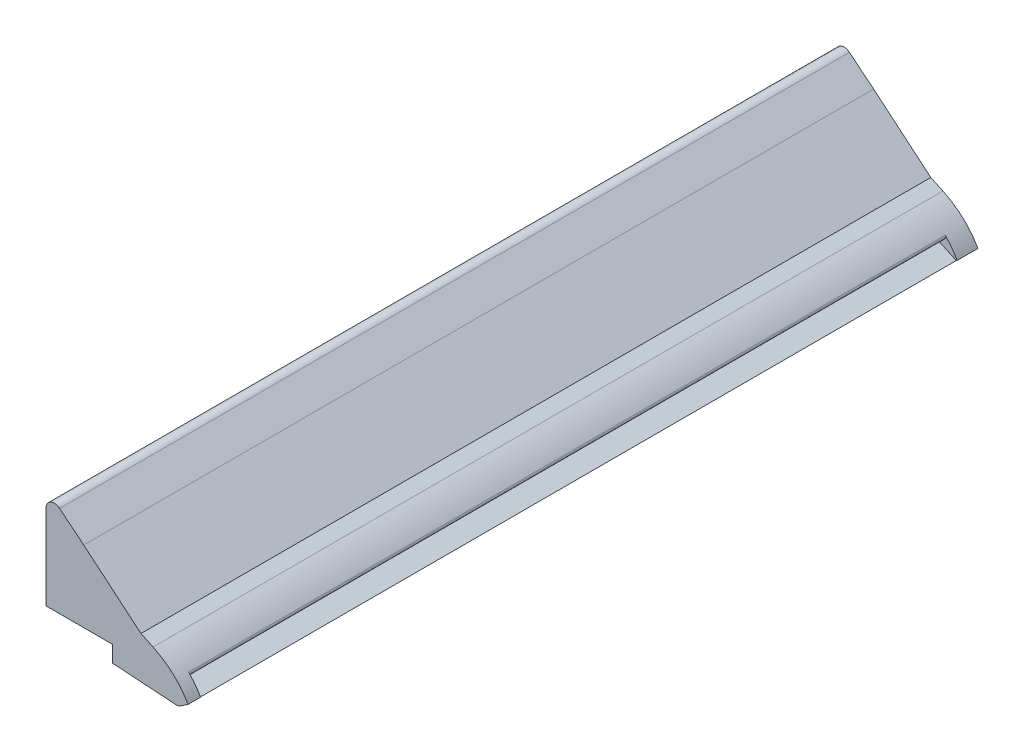
ISO-10303-21;
HEADER;
FILE_DESCRIPTION(('STEP AP214'),'2;1');
FILE_NAME('part.step','',(''),(''),'','','');
FILE_SCHEMA(('AUTOMOTIVE_DESIGN { 1 0 10303 214 1 1 1 1 }'));
ENDSEC;
DATA;
#1=APPLICATION_CONTEXT('core data for automotive mechanical design processes');
#2=APPLICATION_PROTOCOL_DEFINITION('international standard','automotive_design',2000,#1);
#3=PRODUCT_CONTEXT('',#1,'mechanical');
#4=PRODUCT('Part','Part','',(#3));
#5=PRODUCT_RELATED_PRODUCT_CATEGORY('part','',(#4));
#6=PRODUCT_DEFINITION_FORMATION('','',#4);
#7=PRODUCT_DEFINITION_CONTEXT('part definition',#1,'design');
#8=PRODUCT_DEFINITION('design','',#6,#7);
#9=PRODUCT_DEFINITION_SHAPE('','',#8);
#10=(LENGTH_UNIT() NAMED_UNIT(*) SI_UNIT(.MILLI.,.METRE.));
#11=(NAMED_UNIT(*) PLANE_ANGLE_UNIT() SI_UNIT($,.RADIAN.));
#12=(NAMED_UNIT(*) SI_UNIT($,.STERADIAN.) SOLID_ANGLE_UNIT());
#13=UNCERTAINTY_MEASURE_WITH_UNIT(LENGTH_MEASURE(1.E-05),#10,'distance_accuracy_value','');
#14=(GEOMETRIC_REPRESENTATION_CONTEXT(3) GLOBAL_UNCERTAINTY_ASSIGNED_CONTEXT((#13)) GLOBAL_UNIT_ASSIGNED_CONTEXT((#10,
#11,#12)) REPRESENTATION_CONTEXT('',''));
#15=CARTESIAN_POINT('',(0.,0.,0.));
#16=DIRECTION('',(0.,0.,1.));
#17=DIRECTION('',(1.,0.,0.));
#18=AXIS2_PLACEMENT_3D('',#15,#16,#17);
#19=CARTESIAN_POINT('',(-16.,12.1896302264411,190.));
#20=DIRECTION('',(1.,0.,0.));
#21=DIRECTION('',(0.,1.,0.));
#22=AXIS2_PLACEMENT_3D('',#19,#20,#21);
#23=PLANE('',#22);
#24=DIRECTION('',(0.,-1.,0.));
#25=VECTOR('',#24,1.);
#26=CARTESIAN_POINT('',(-16.,29.6000463820284,190.));
#27=LINE('',#26,#25);
#28=CARTESIAN_POINT('',(-16.,25.3955733440635,190.));
#29=VERTEX_POINT('',#28);
#30=CARTESIAN_POINT('',(-16.,5.,190.));
#31=VERTEX_POINT('',#30);
#32=EDGE_CURVE('E217',#29,#31,#27,.T.);
#33=ORIENTED_EDGE('',*,*,#32,.F.);
#34=DIRECTION('',(0.,0.,-1.));
#35=VECTOR('',#34,1.);
#36=CARTESIAN_POINT('',(-16.,25.3955733440635,190.));
#37=LINE('',#36,#35);
#38=CARTESIAN_POINT('',(-16.,25.3955733440635,0.));
#39=VERTEX_POINT('',#38);
#40=EDGE_CURVE('E208',#29,#39,#37,.T.);
#41=ORIENTED_EDGE('',*,*,#40,.T.);
#42=DIRECTION('',(0.,-1.,0.));
#43=VECTOR('',#42,1.);
#44=CARTESIAN_POINT('',(-16.,12.1896302264411,0.));
#45=LINE('',#44,#43);
#46=CARTESIAN_POINT('',(-16.,5.,0.));
#47=VERTEX_POINT('',#46);
#48=EDGE_CURVE('E215',#39,#47,#45,.T.);
#49=ORIENTED_EDGE('',*,*,#48,.T.);
#50=DIRECTION('',(0.,0.,-1.));
#51=VECTOR('',#50,1.);
#52=CARTESIAN_POINT('',(-16.,5.,190.));
#53=LINE('',#52,#51);
#54=EDGE_CURVE('E185',#31,#47,#53,.T.);
#55=ORIENTED_EDGE('',*,*,#54,.F.);
#56=EDGE_LOOP('',(#33,#41,#49,#55));
#57=FACE_BOUND('',#56,.T.);
#58=ADVANCED_FACE('F33',(#57),#23,.F.);
#59=CARTESIAN_POINT('',(-16.,5.,190.));
#60=DIRECTION('',(0.,1.,0.));
#61=DIRECTION('',(0.,0.,1.));
#62=AXIS2_PLACEMENT_3D('',#59,#60,#61);
#63=PLANE('',#62);
#64=DIRECTION('',(1.,0.,0.));
#65=VECTOR('',#64,1.);
#66=CARTESIAN_POINT('',(-16.,5.,0.));
#67=LINE('',#66,#65);
#68=CARTESIAN_POINT('',(0.,5.,0.));
#69=VERTEX_POINT('',#68);
#70=EDGE_CURVE('E223',#47,#69,#67,.T.);
#71=ORIENTED_EDGE('',*,*,#70,.T.);
#72=DIRECTION('',(0.,0.,-1.));
#73=VECTOR('',#72,1.);
#74=CARTESIAN_POINT('',(0.,5.,190.));
#75=LINE('',#74,#73);
#76=CARTESIAN_POINT('',(0.,5.,190.));
#77=VERTEX_POINT('',#76);
#78=EDGE_CURVE('E249',#77,#69,#75,.T.);
#79=ORIENTED_EDGE('',*,*,#78,.F.);
#80=DIRECTION('',(1.,0.,0.));
#81=VECTOR('',#80,1.);
#82=CARTESIAN_POINT('',(-16.,5.,190.));
#83=LINE('',#82,#81);
#84=EDGE_CURVE('E270',#31,#77,#83,.T.);
#85=ORIENTED_EDGE('',*,*,#84,.F.);
#86=ORIENTED_EDGE('',*,*,#54,.T.);
#87=EDGE_LOOP('',(#71,#79,#85,#86));
#88=FACE_BOUND('',#87,.T.);
#89=ADVANCED_FACE('F312',(#88),#63,.F.);
#90=CARTESIAN_POINT('',(0.,5.,190.));
#91=DIRECTION('',(1.,0.,0.));
#92=DIRECTION('',(0.,1.,0.));
#93=AXIS2_PLACEMENT_3D('',#90,#91,#92);
#94=PLANE('',#93);
#95=DIRECTION('',(0.,-1.,0.));
#96=VECTOR('',#95,1.);
#97=CARTESIAN_POINT('',(0.,5.,0.));
#98=LINE('',#97,#96);
#99=CARTESIAN_POINT('',(0.,1.07124124526952,0.));
#100=VERTEX_POINT('',#99);
#101=EDGE_CURVE('E226',#69,#100,#98,.T.);
#102=ORIENTED_EDGE('',*,*,#101,.T.);
#103=DIRECTION('',(0.,0.,1.));
#104=VECTOR('',#103,1.);
#105=CARTESIAN_POINT('',(0.,1.07124124526952,-13.));
#106=LINE('',#105,#104);
#107=CARTESIAN_POINT('',(0.,1.07124124526952,190.));
#108=VERTEX_POINT('',#107);
#109=EDGE_CURVE('E298',#100,#108,#106,.T.);
#110=ORIENTED_EDGE('',*,*,#109,.T.);
#111=DIRECTION('',(0.,-1.,0.));
#112=VECTOR('',#111,1.);
#113=CARTESIAN_POINT('',(0.,5.,190.));
#114=LINE('',#113,#112);
#115=EDGE_CURVE('E265',#77,#108,#114,.T.);
#116=ORIENTED_EDGE('',*,*,#115,.F.);
#117=ORIENTED_EDGE('',*,*,#78,.T.);
#118=EDGE_LOOP('',(#102,#110,#116,#117));
#119=FACE_BOUND('',#118,.T.);
#120=ADVANCED_FACE('F308',(#119),#94,.F.);
#121=CARTESIAN_POINT('',(19.,5.,190.));
#122=DIRECTION('',(-0.422618261740694,-0.906307787036653,0.));
#123=DIRECTION('',(0.906307787036653,-0.422618261740694,0.));
#124=AXIS2_PLACEMENT_3D('',#121,#122,#123);
#125=PLANE('',#124);
#126=DIRECTION('',(-0.906307787036653,0.422618261740694,0.));
#127=VECTOR('',#126,1.);
#128=CARTESIAN_POINT('',(19.,5.,190.));
#129=LINE('',#128,#127);
#130=CARTESIAN_POINT('',(9.75376845876004,9.31158857675442,190.));
#131=VERTEX_POINT('',#130);
#132=CARTESIAN_POINT('',(6.83805716986868,10.6712070797334,190.));
#133=VERTEX_POINT('',#132);
#134=EDGE_CURVE('E256',#131,#133,#129,.T.);
#135=ORIENTED_EDGE('',*,*,#134,.F.);
#136=DIRECTION('',(0.,0.,-1.));
#137=VECTOR('',#136,1.);
#138=CARTESIAN_POINT('',(9.75376845876005,9.31158857675442,190.));
#139=LINE('',#138,#137);
#140=CARTESIAN_POINT('',(9.75376845876004,9.31158857675442,0.));
#141=VERTEX_POINT('',#140);
#142=EDGE_CURVE('E175',#131,#141,#139,.T.);
#143=ORIENTED_EDGE('',*,*,#142,.T.);
#144=DIRECTION('',(-0.906307787036653,0.422618261740694,0.));
#145=VECTOR('',#144,1.);
#146=CARTESIAN_POINT('',(19.,5.,0.));
#147=LINE('',#146,#145);
#148=CARTESIAN_POINT('',(6.83805716986868,10.6712070797334,0.));
#149=VERTEX_POINT('',#148);
#150=EDGE_CURVE('E237',#141,#149,#147,.T.);
#151=ORIENTED_EDGE('',*,*,#150,.T.);
#152=DIRECTION('',(0.,0.,-1.));
#153=VECTOR('',#152,1.);
#154=CARTESIAN_POINT('',(6.83805716986868,10.6712070797334,190.));
#155=LINE('',#154,#153);
#156=EDGE_CURVE('E246',#133,#149,#155,.T.);
#157=ORIENTED_EDGE('',*,*,#156,.F.);
#158=EDGE_LOOP('',(#135,#143,#151,#157));
#159=FACE_BOUND('',#158,.T.);
#160=ADVANCED_FACE('F254',(#159),#125,.F.);
#161=CARTESIAN_POINT('',(6.83805716986868,10.6712070797334,190.));
#162=DIRECTION('',(-0.642787609686535,-0.766044443118982,0.));
#163=DIRECTION('',(0.766044443118982,-0.642787609686535,0.));
#164=AXIS2_PLACEMENT_3D('',#161,#162,#163);
#165=PLANE('',#164);
#166=DIRECTION('',(-0.766044443118982,0.642787609686535,0.));
#167=VECTOR('',#166,1.);
#168=CARTESIAN_POINT('',(6.83805716986868,10.6712070797334,0.));
#169=LINE('',#168,#167);
#170=CARTESIAN_POINT('',(-6.91649822035299,22.2126494346758,0.));
#171=VERTEX_POINT('',#170);
#172=EDGE_CURVE('E239',#149,#171,#169,.T.);
#173=ORIENTED_EDGE('',*,*,#172,.T.);
#174=DIRECTION('',(0.,0.,-1.));
#175=VECTOR('',#174,1.);
#176=CARTESIAN_POINT('',(-6.91649822035299,22.2126494346758,190.));
#177=LINE('',#176,#175);
#178=CARTESIAN_POINT('',(-6.91649822035299,22.2126494346758,190.));
#179=VERTEX_POINT('',#178);
#180=EDGE_CURVE('E243',#179,#171,#177,.T.);
#181=ORIENTED_EDGE('',*,*,#180,.F.);
#182=DIRECTION('',(-0.766044443118982,0.642787609686535,0.));
#183=VECTOR('',#182,1.);
#184=CARTESIAN_POINT('',(6.83805716986868,10.6712070797334,190.));
#185=LINE('',#184,#183);
#186=EDGE_CURVE('E264',#133,#179,#185,.T.);
#187=ORIENTED_EDGE('',*,*,#186,.F.);
#188=ORIENTED_EDGE('',*,*,#156,.T.);
#189=EDGE_LOOP('',(#173,#181,#187,#188));
#190=FACE_BOUND('',#189,.T.);
#191=ADVANCED_FACE('F261',(#190),#165,.F.);
#192=CARTESIAN_POINT('',(-6.91649822035299,22.2126494346758,190.));
#193=DIRECTION('',(-0.630955346125227,-0.775819148510782,0.));
#194=DIRECTION('',(0.775819148510782,-0.630955346125227,0.));
#195=AXIS2_PLACEMENT_3D('',#192,#193,#194);
#196=PLANE('',#195);
#197=DIRECTION('',(-0.775819148510782,0.630955346125227,0.));
#198=VECTOR('',#197,1.);
#199=CARTESIAN_POINT('',(-6.91649822035299,22.2126494346758,0.));
#200=LINE('',#199,#198);
#201=CARTESIAN_POINT('',(-12.7380893077496,26.9472116410851,0.));
#202=VERTEX_POINT('',#201);
#203=EDGE_CURVE('E241',#171,#202,#200,.T.);
#204=ORIENTED_EDGE('',*,*,#203,.T.);
#205=DIRECTION('',(0.,0.,-1.));
#206=VECTOR('',#205,1.);
#207=CARTESIAN_POINT('',(-12.7380893077496,26.9472116410851,190.));
#208=LINE('',#207,#206);
#209=CARTESIAN_POINT('',(-12.7380893077496,26.9472116410851,190.));
#210=VERTEX_POINT('',#209);
#211=EDGE_CURVE('E41',#202,#210,#208,.F.);
#212=ORIENTED_EDGE('',*,*,#211,.T.);
#213=DIRECTION('',(-0.775819148510782,0.630955346125227,0.));
#214=VECTOR('',#213,1.);
#215=CARTESIAN_POINT('',(-6.91649822035299,22.2126494346758,190.));
#216=LINE('',#215,#214);
#217=EDGE_CURVE('E232',#179,#210,#216,.T.);
#218=ORIENTED_EDGE('',*,*,#217,.F.);
#219=ORIENTED_EDGE('',*,*,#180,.T.);
#220=EDGE_LOOP('',(#204,#212,#218,#219));
#221=FACE_BOUND('',#220,.T.);
#222=ADVANCED_FACE('F263',(#221),#196,.F.);
#223=CARTESIAN_POINT('',(0.,0.,190.));
#224=DIRECTION('',(0.,0.,1.));
#225=DIRECTION('',(1.,0.,0.));
#226=AXIS2_PLACEMENT_3D('',#223,#224,#225);
#227=PLANE('',#226);
#228=ORIENTED_EDGE('',*,*,#217,.T.);
#229=CARTESIAN_POINT('',(-14.,25.3955733440635,190.));
#230=DIRECTION('',(0.,0.,1.));
#231=DIRECTION('',(1.,0.,0.));
#232=AXIS2_PLACEMENT_3D('',#229,#230,#231);
#233=CIRCLE('',#232,2.);
#234=EDGE_CURVE('E11',#210,#29,#233,.T.);
#235=ORIENTED_EDGE('',*,*,#234,.T.);
#236=ORIENTED_EDGE('',*,*,#32,.T.);
#237=ORIENTED_EDGE('',*,*,#84,.T.);
#238=ORIENTED_EDGE('',*,*,#115,.T.);
#239=DIRECTION('',(-0.997726373210861,0.0673949864567225,0.));
#240=VECTOR('',#239,1.);
#241=CARTESIAN_POINT('',(0.,1.07124124526952,190.));
#242=LINE('',#241,#240);
#243=CARTESIAN_POINT('',(15.1751652634888,0.0461805824747412,190.));
#244=VERTEX_POINT('',#243);
#245=EDGE_CURVE('E170',#244,#108,#242,.T.);
#246=ORIENTED_EDGE('',*,*,#245,.F.);
#247=CARTESIAN_POINT('',(15.3099552364022,2.04163332889646,190.));
#248=DIRECTION('',(0.,0.,1.));
#249=DIRECTION('',(1.,0.,0.));
#250=AXIS2_PLACEMENT_3D('',#247,#248,#249);
#251=CIRCLE('',#250,2.);
#252=CARTESIAN_POINT('',(16.4271748880226,0.382772198471969,190.));
#253=VERTEX_POINT('',#252);
#254=EDGE_CURVE('E169',#244,#253,#251,.T.);
#255=ORIENTED_EDGE('',*,*,#254,.T.);
#256=DIRECTION('',(-0.829430565212247,-0.558609825810192,0.));
#257=VECTOR('',#256,1.);
#258=CARTESIAN_POINT('',(15.8588301395827,0.,190.));
#259=LINE('',#258,#257);
#260=CARTESIAN_POINT('',(18.1907430791427,1.57051058353364,190.));
#261=VERTEX_POINT('',#260);
#262=EDGE_CURVE('E155',#261,#253,#259,.T.);
#263=ORIENTED_EDGE('',*,*,#262,.F.);
#264=CARTESIAN_POINT('',(1.72402148568686,-7.90825937694198,190.));
#265=DIRECTION('',(0.,0.,1.));
#266=DIRECTION('',(1.,0.,0.));
#267=AXIS2_PLACEMENT_3D('',#264,#265,#266);
#268=CIRCLE('',#267,19.);
#269=EDGE_CURVE('E163',#261,#131,#268,.T.);
#270=ORIENTED_EDGE('',*,*,#269,.T.);
#271=ORIENTED_EDGE('',*,*,#134,.T.);
#272=ORIENTED_EDGE('',*,*,#186,.T.);
#273=EDGE_LOOP('',(#228,#235,#236,#237,#238,#246,#255,#263,#270,#271,#272));
#274=FACE_BOUND('',#273,.T.);
#275=ADVANCED_FACE('F166',(#274),#227,.T.);
#276=CARTESIAN_POINT('',(0.,0.,0.));
#277=DIRECTION('',(0.,0.,1.));
#278=DIRECTION('',(1.,0.,0.));
#279=AXIS2_PLACEMENT_3D('',#276,#277,#278);
#280=PLANE('',#279);
#281=ORIENTED_EDGE('',*,*,#48,.F.);
#282=CARTESIAN_POINT('',(-14.,25.3955733440635,0.));
#283=DIRECTION('',(0.,0.,1.));
#284=DIRECTION('',(1.,0.,0.));
#285=AXIS2_PLACEMENT_3D('',#282,#283,#284);
#286=CIRCLE('',#285,2.);
#287=EDGE_CURVE('E55',#39,#202,#286,.F.);
#288=ORIENTED_EDGE('',*,*,#287,.T.);
#289=ORIENTED_EDGE('',*,*,#203,.F.);
#290=ORIENTED_EDGE('',*,*,#172,.F.);
#291=ORIENTED_EDGE('',*,*,#150,.F.);
#292=CARTESIAN_POINT('',(1.72402148568686,-7.90825937694198,0.));
#293=DIRECTION('',(0.,0.,1.));
#294=DIRECTION('',(1.,0.,0.));
#295=AXIS2_PLACEMENT_3D('',#292,#293,#294);
#296=CIRCLE('',#295,19.);
#297=CARTESIAN_POINT('',(18.1907430791427,1.57051058353364,0.));
#298=VERTEX_POINT('',#297);
#299=EDGE_CURVE('E176',#141,#298,#296,.F.);
#300=ORIENTED_EDGE('',*,*,#299,.T.);
#301=DIRECTION('',(-0.829430565212247,-0.558609825810192,0.));
#302=VECTOR('',#301,1.);
#303=CARTESIAN_POINT('',(4.94866765959747,-7.34784105881836,0.));
#304=LINE('',#303,#302);
#305=CARTESIAN_POINT('',(16.4271748880226,0.382772198471971,0.));
#306=VERTEX_POINT('',#305);
#307=EDGE_CURVE('E285',#298,#306,#304,.T.);
#308=ORIENTED_EDGE('',*,*,#307,.T.);
#309=CARTESIAN_POINT('',(15.3099552364022,2.04163332889646,0.));
#310=DIRECTION('',(0.,0.,1.));
#311=DIRECTION('',(1.,0.,0.));
#312=AXIS2_PLACEMENT_3D('',#309,#310,#311);
#313=CIRCLE('',#312,2.);
#314=CARTESIAN_POINT('',(15.1751652634888,0.046180582474741,0.));
#315=VERTEX_POINT('',#314);
#316=EDGE_CURVE('E206',#306,#315,#313,.F.);
#317=ORIENTED_EDGE('',*,*,#316,.T.);
#318=DIRECTION('',(-0.997726373210861,0.0673949864567226,0.));
#319=VECTOR('',#318,1.);
#320=CARTESIAN_POINT('',(0.072032141799582,1.06637557733552,0.));
#321=LINE('',#320,#319);
#322=EDGE_CURVE('E187',#315,#100,#321,.T.);
#323=ORIENTED_EDGE('',*,*,#322,.T.);
#324=ORIENTED_EDGE('',*,*,#101,.F.);
#325=ORIENTED_EDGE('',*,*,#70,.F.);
#326=EDGE_LOOP('',(#281,#288,#289,#290,#291,#300,#308,#317,#323,#324,#325));
#327=FACE_BOUND('',#326,.T.);
#328=ADVANCED_FACE('F221',(#327),#280,.F.);
#329=CARTESIAN_POINT('',(2.87384425926701,8.45236523481401,187.));
#330=DIRECTION('',(0.4226182617407,0.90630778703665,0.));
#331=DIRECTION('',(-0.90630778703665,0.4226182617407,0.));
#332=AXIS2_PLACEMENT_3D('',#329,#330,#331);
#333=PLANE('',#332);
#334=DIRECTION('',(0.,0.,1.));
#335=VECTOR('',#334,1.);
#336=CARTESIAN_POINT('',(17.9621643544492,1.41656602573658,187.));
#337=LINE('',#336,#335);
#338=CARTESIAN_POINT('',(17.9621643544492,1.41656602573659,5.));
#339=VERTEX_POINT('',#338);
#340=CARTESIAN_POINT('',(17.9621643544492,1.41656602573658,187.));
#341=VERTEX_POINT('',#340);
#342=EDGE_CURVE('E294',#339,#341,#337,.T.);
#343=ORIENTED_EDGE('',*,*,#342,.F.);
#344=DIRECTION('',(0.90630778703665,-0.4226182617407,0.));
#345=VECTOR('',#344,1.);
#346=CARTESIAN_POINT('',(2.87384425926701,8.45236523481401,5.));
#347=LINE('',#346,#345);
#348=CARTESIAN_POINT('',(2.87384425926701,8.45236523481401,5.));
#349=VERTEX_POINT('',#348);
#350=EDGE_CURVE('E279',#349,#339,#347,.T.);
#351=ORIENTED_EDGE('',*,*,#350,.F.);
#352=DIRECTION('',(0.,0.,-1.));
#353=VECTOR('',#352,1.);
#354=CARTESIAN_POINT('',(2.87384425926701,8.45236523481401,187.));
#355=LINE('',#354,#353);
#356=CARTESIAN_POINT('',(2.87384425926701,8.45236523481401,187.));
#357=VERTEX_POINT('',#356);
#358=EDGE_CURVE('E224',#357,#349,#355,.T.);
#359=ORIENTED_EDGE('',*,*,#358,.F.);
#360=DIRECTION('',(0.90630778703665,-0.4226182617407,0.));
#361=VECTOR('',#360,1.);
#362=CARTESIAN_POINT('',(2.87384425926701,8.45236523481401,187.));
#363=LINE('',#362,#361);
#364=EDGE_CURVE('E287',#357,#341,#363,.T.);
#365=ORIENTED_EDGE('',*,*,#364,.T.);
#366=EDGE_LOOP('',(#343,#351,#359,#365));
#367=FACE_BOUND('',#366,.T.);
#368=ADVANCED_FACE('F326',(#367),#333,.T.);
#369=CARTESIAN_POINT('',(21.6339273926111,1.35946168055497,187.));
#370=DIRECTION('',(-0.4226182617407,-0.90630778703665,0.));
#371=DIRECTION('',(0.90630778703665,-0.4226182617407,0.));
#372=AXIS2_PLACEMENT_3D('',#369,#370,#371);
#373=PLANE('',#372);
#374=DIRECTION('',(-0.90630778703665,0.4226182617407,0.));
#375=VECTOR('',#374,1.);
#376=CARTESIAN_POINT('',(21.6339273926111,1.35946168055497,5.));
#377=LINE('',#376,#375);
#378=CARTESIAN_POINT('',(14.7372191767647,4.57544953766465,5.));
#379=VERTEX_POINT('',#378);
#380=CARTESIAN_POINT('',(3.50777165187806,9.81182691536898,5.));
#381=VERTEX_POINT('',#380);
#382=EDGE_CURVE('E276',#379,#381,#377,.T.);
#383=ORIENTED_EDGE('',*,*,#382,.F.);
#384=DIRECTION('',(0.,0.,-1.));
#385=VECTOR('',#384,1.);
#386=CARTESIAN_POINT('',(14.7372191767647,4.57544953766465,187.));
#387=LINE('',#386,#385);
#388=CARTESIAN_POINT('',(14.7372191767647,4.57544953766465,187.));
#389=VERTEX_POINT('',#388);
#390=EDGE_CURVE('E189',#379,#389,#387,.F.);
#391=ORIENTED_EDGE('',*,*,#390,.T.);
#392=DIRECTION('',(-0.90630778703665,0.4226182617407,0.));
#393=VECTOR('',#392,1.);
#394=CARTESIAN_POINT('',(21.6339273926111,1.35946168055497,187.));
#395=LINE('',#394,#393);
#396=CARTESIAN_POINT('',(3.50777165187806,9.81182691536898,187.));
#397=VERTEX_POINT('',#396);
#398=EDGE_CURVE('E275',#389,#397,#395,.T.);
#399=ORIENTED_EDGE('',*,*,#398,.T.);
#400=DIRECTION('',(0.,0.,-1.));
#401=VECTOR('',#400,1.);
#402=CARTESIAN_POINT('',(3.50777165187806,9.81182691536898,187.));
#403=LINE('',#402,#401);
#404=EDGE_CURVE('E229',#397,#381,#403,.T.);
#405=ORIENTED_EDGE('',*,*,#404,.T.);
#406=EDGE_LOOP('',(#383,#391,#399,#405));
#407=FACE_BOUND('',#406,.T.);
#408=ADVANCED_FACE('F337',(#407),#373,.T.);
#409=CARTESIAN_POINT('',(0.,0.,187.));
#410=DIRECTION('',(0.,0.,1.));
#411=DIRECTION('',(1.,0.,0.));
#412=AXIS2_PLACEMENT_3D('',#409,#410,#411);
#413=PLANE('',#412);
#414=CARTESIAN_POINT('',(1.72402148568686,-7.90825937694198,187.));
#415=DIRECTION('',(0.,0.,1.));
#416=DIRECTION('',(1.,0.,0.));
#417=AXIS2_PLACEMENT_3D('',#414,#415,#416);
#418=CIRCLE('',#417,19.);
#419=CARTESIAN_POINT('',(18.1907430791427,1.57051058353364,187.));
#420=VERTEX_POINT('',#419);
#421=CARTESIAN_POINT('',(15.3059474109309,5.37824837194311,187.));
#422=VERTEX_POINT('',#421);
#423=EDGE_CURVE('E184',#420,#422,#418,.T.);
#424=ORIENTED_EDGE('',*,*,#423,.F.);
#425=DIRECTION('',(-0.829430565212247,-0.558609825810192,0.));
#426=VECTOR('',#425,1.);
#427=CARTESIAN_POINT('',(4.94866765959747,-7.34784105881836,187.));
#428=LINE('',#427,#426);
#429=EDGE_CURVE('E158',#420,#341,#428,.T.);
#430=ORIENTED_EDGE('',*,*,#429,.T.);
#431=ORIENTED_EDGE('',*,*,#364,.F.);
#432=DIRECTION('',(-0.4226182617407,-0.906307787036649,0.));
#433=VECTOR('',#432,1.);
#434=CARTESIAN_POINT('',(3.50777165187806,9.81182691536898,187.));
#435=LINE('',#434,#433);
#436=EDGE_CURVE('E278',#397,#357,#435,.T.);
#437=ORIENTED_EDGE('',*,*,#436,.F.);
#438=ORIENTED_EDGE('',*,*,#398,.F.);
#439=CARTESIAN_POINT('',(14.948528307635,5.02860343118298,187.));
#440=DIRECTION('',(0.,0.,1.));
#441=DIRECTION('',(1.,0.,0.));
#442=AXIS2_PLACEMENT_3D('',#439,#440,#441);
#443=CIRCLE('',#442,0.5);
#444=EDGE_CURVE('E195',#389,#422,#443,.T.);
#445=ORIENTED_EDGE('',*,*,#444,.T.);
#446=EDGE_LOOP('',(#424,#430,#431,#437,#438,#445));
#447=FACE_BOUND('',#446,.T.);
#448=ADVANCED_FACE('F330',(#447),#413,.F.);
#449=CARTESIAN_POINT('',(0.,0.,5.));
#450=DIRECTION('',(0.,0.,1.));
#451=DIRECTION('',(1.,0.,0.));
#452=AXIS2_PLACEMENT_3D('',#449,#450,#451);
#453=PLANE('',#452);
#454=DIRECTION('',(-0.829430565212247,-0.558609825810192,0.));
#455=VECTOR('',#454,1.);
#456=CARTESIAN_POINT('',(4.94866765959747,-7.34784105881836,5.));
#457=LINE('',#456,#455);
#458=CARTESIAN_POINT('',(18.1907430791427,1.57051058353364,5.));
#459=VERTEX_POINT('',#458);
#460=EDGE_CURVE('E296',#459,#339,#457,.T.);
#461=ORIENTED_EDGE('',*,*,#460,.F.);
#462=CARTESIAN_POINT('',(1.72402148568686,-7.90825937694198,5.));
#463=DIRECTION('',(0.,0.,1.));
#464=DIRECTION('',(1.,0.,0.));
#465=AXIS2_PLACEMENT_3D('',#462,#463,#464);
#466=CIRCLE('',#465,19.);
#467=CARTESIAN_POINT('',(15.3059474109309,5.37824837194311,5.));
#468=VERTEX_POINT('',#467);
#469=EDGE_CURVE('E182',#459,#468,#466,.T.);
#470=ORIENTED_EDGE('',*,*,#469,.T.);
#471=CARTESIAN_POINT('',(14.948528307635,5.02860343118298,5.));
#472=DIRECTION('',(0.,0.,1.));
#473=DIRECTION('',(1.,0.,0.));
#474=AXIS2_PLACEMENT_3D('',#471,#472,#473);
#475=CIRCLE('',#474,0.5);
#476=EDGE_CURVE('E198',#468,#379,#475,.F.);
#477=ORIENTED_EDGE('',*,*,#476,.T.);
#478=ORIENTED_EDGE('',*,*,#382,.T.);
#479=DIRECTION('',(-0.4226182617407,-0.906307787036649,0.));
#480=VECTOR('',#479,1.);
#481=CARTESIAN_POINT('',(3.50777165187806,9.81182691536898,5.));
#482=LINE('',#481,#480);
#483=EDGE_CURVE('E282',#381,#349,#482,.T.);
#484=ORIENTED_EDGE('',*,*,#483,.T.);
#485=ORIENTED_EDGE('',*,*,#350,.T.);
#486=EDGE_LOOP('',(#461,#470,#477,#478,#484,#485));
#487=FACE_BOUND('',#486,.T.);
#488=ADVANCED_FACE('F322',(#487),#453,.T.);
#489=CARTESIAN_POINT('',(3.50777165187806,9.81182691536898,187.));
#490=DIRECTION('',(0.906307787036649,-0.4226182617407,0.));
#491=DIRECTION('',(0.4226182617407,0.906307787036649,0.));
#492=AXIS2_PLACEMENT_3D('',#489,#490,#491);
#493=PLANE('',#492);
#494=ORIENTED_EDGE('',*,*,#483,.F.);
#495=ORIENTED_EDGE('',*,*,#404,.F.);
#496=ORIENTED_EDGE('',*,*,#436,.T.);
#497=ORIENTED_EDGE('',*,*,#358,.T.);
#498=EDGE_LOOP('',(#494,#495,#496,#497));
#499=FACE_BOUND('',#498,.T.);
#500=ADVANCED_FACE('F335',(#499),#493,.T.);
#501=CARTESIAN_POINT('',(1.72402148568686,-7.90825937694198,190.));
#502=DIRECTION('',(0.,0.,-1.));
#503=DIRECTION('',(-1.,0.,0.));
#504=AXIS2_PLACEMENT_3D('',#501,#502,#503);
#505=CYLINDRICAL_SURFACE('',#504,19.);
#506=ORIENTED_EDGE('',*,*,#423,.T.);
#507=DIRECTION('',(0.,0.,-1.));
#508=VECTOR('',#507,1.);
#509=CARTESIAN_POINT('',(15.3059474109309,5.37824837194311,190.));
#510=LINE('',#509,#508);
#511=EDGE_CURVE('E192',#422,#468,#510,.T.);
#512=ORIENTED_EDGE('',*,*,#511,.T.);
#513=ORIENTED_EDGE('',*,*,#469,.F.);
#514=DIRECTION('',(0.,0.,-1.));
#515=VECTOR('',#514,1.);
#516=CARTESIAN_POINT('',(18.1907430791427,1.57051058353364,190.));
#517=LINE('',#516,#515);
#518=EDGE_CURVE('E162',#298,#459,#517,.F.);
#519=ORIENTED_EDGE('',*,*,#518,.F.);
#520=ORIENTED_EDGE('',*,*,#299,.F.);
#521=ORIENTED_EDGE('',*,*,#142,.F.);
#522=ORIENTED_EDGE('',*,*,#269,.F.);
#523=EDGE_CURVE('E152',#420,#261,#517,.F.);
#524=ORIENTED_EDGE('',*,*,#523,.F.);
#525=EDGE_LOOP('',(#506,#512,#513,#519,#520,#521,#522,#524));
#526=FACE_BOUND('',#525,.T.);
#527=ADVANCED_FACE('F173',(#526),#505,.T.);
#528=CARTESIAN_POINT('',(0.,1.07124124526952,-13.));
#529=DIRECTION('',(0.0673949864567226,0.997726373210861,0.));
#530=DIRECTION('',(-0.997726373210861,0.0673949864567226,0.));
#531=AXIS2_PLACEMENT_3D('',#528,#529,#530);
#532=PLANE('',#531);
#533=ORIENTED_EDGE('',*,*,#322,.F.);
#534=DIRECTION('',(0.,0.,1.));
#535=VECTOR('',#534,1.);
#536=CARTESIAN_POINT('',(15.1751652634888,0.046180582474741,-13.));
#537=LINE('',#536,#535);
#538=EDGE_CURVE('E200',#315,#244,#537,.T.);
#539=ORIENTED_EDGE('',*,*,#538,.T.);
#540=ORIENTED_EDGE('',*,*,#245,.T.);
#541=ORIENTED_EDGE('',*,*,#109,.F.);
#542=EDGE_LOOP('',(#533,#539,#540,#541));
#543=FACE_BOUND('',#542,.T.);
#544=ADVANCED_FACE('F304',(#543),#532,.F.);
#545=CARTESIAN_POINT('',(15.8588301395827,0.,-13.));
#546=DIRECTION('',(-0.558609825810192,0.829430565212247,0.));
#547=DIRECTION('',(-0.829430565212247,-0.558609825810192,0.));
#548=AXIS2_PLACEMENT_3D('',#545,#546,#547);
#549=PLANE('',#548);
#550=ORIENTED_EDGE('',*,*,#262,.T.);
#551=DIRECTION('',(0.,0.,1.));
#552=VECTOR('',#551,1.);
#553=CARTESIAN_POINT('',(16.4271748880226,0.382772198471969,-13.));
#554=LINE('',#553,#552);
#555=EDGE_CURVE('E204',#253,#306,#554,.F.);
#556=ORIENTED_EDGE('',*,*,#555,.T.);
#557=ORIENTED_EDGE('',*,*,#307,.F.);
#558=ORIENTED_EDGE('',*,*,#518,.T.);
#559=ORIENTED_EDGE('',*,*,#460,.T.);
#560=ORIENTED_EDGE('',*,*,#342,.T.);
#561=ORIENTED_EDGE('',*,*,#429,.F.);
#562=ORIENTED_EDGE('',*,*,#523,.T.);
#563=EDGE_LOOP('',(#550,#556,#557,#558,#559,#560,#561,#562));
#564=FACE_BOUND('',#563,.T.);
#565=ADVANCED_FACE('F154',(#564),#549,.F.);
#566=CARTESIAN_POINT('',(14.948528307635,5.02860343118298,190.));
#567=DIRECTION('',(0.,0.,-1.));
#568=DIRECTION('',(-1.,0.,0.));
#569=AXIS2_PLACEMENT_3D('',#566,#567,#568);
#570=CYLINDRICAL_SURFACE('',#569,0.5);
#571=ORIENTED_EDGE('',*,*,#476,.F.);
#572=ORIENTED_EDGE('',*,*,#511,.F.);
#573=ORIENTED_EDGE('',*,*,#444,.F.);
#574=ORIENTED_EDGE('',*,*,#390,.F.);
#575=EDGE_LOOP('',(#571,#572,#573,#574));
#576=FACE_BOUND('',#575,.T.);
#577=ADVANCED_FACE('F340',(#576),#570,.T.);
#578=CARTESIAN_POINT('',(15.3099552364022,2.04163332889646,-13.));
#579=DIRECTION('',(0.,0.,1.));
#580=DIRECTION('',(1.,0.,0.));
#581=AXIS2_PLACEMENT_3D('',#578,#579,#580);
#582=CYLINDRICAL_SURFACE('',#581,2.);
#583=ORIENTED_EDGE('',*,*,#316,.F.);
#584=ORIENTED_EDGE('',*,*,#555,.F.);
#585=ORIENTED_EDGE('',*,*,#254,.F.);
#586=ORIENTED_EDGE('',*,*,#538,.F.);
#587=EDGE_LOOP('',(#583,#584,#585,#586));
#588=FACE_BOUND('',#587,.T.);
#589=ADVANCED_FACE('F315',(#588),#582,.T.);
#590=CARTESIAN_POINT('',(-14.,25.3955733440635,190.));
#591=DIRECTION('',(0.,0.,-1.));
#592=DIRECTION('',(-1.,0.,0.));
#593=AXIS2_PLACEMENT_3D('',#590,#591,#592);
#594=CYLINDRICAL_SURFACE('',#593,2.);
#595=ORIENTED_EDGE('',*,*,#234,.F.);
#596=ORIENTED_EDGE('',*,*,#211,.F.);
#597=ORIENTED_EDGE('',*,*,#287,.F.);
#598=ORIENTED_EDGE('',*,*,#40,.F.);
#599=EDGE_LOOP('',(#595,#596,#597,#598));
#600=FACE_BOUND('',#599,.T.);
#601=ADVANCED_FACE('F35',(#600),#594,.T.);
#602=CLOSED_SHELL('',(#58,#89,#120,#160,#191,#222,#275,#328,#368,#408,#448,#488,#500,#527,#544,
#565,#577,#589,#601));
#603=MANIFOLD_SOLID_BREP('B2',#602);
#604=ADVANCED_BREP_SHAPE_REPRESENTATION('',(#18,#603),#14);
#605=SHAPE_DEFINITION_REPRESENTATION(#9,#604);
ENDSEC;
END-ISO-10303-21;
